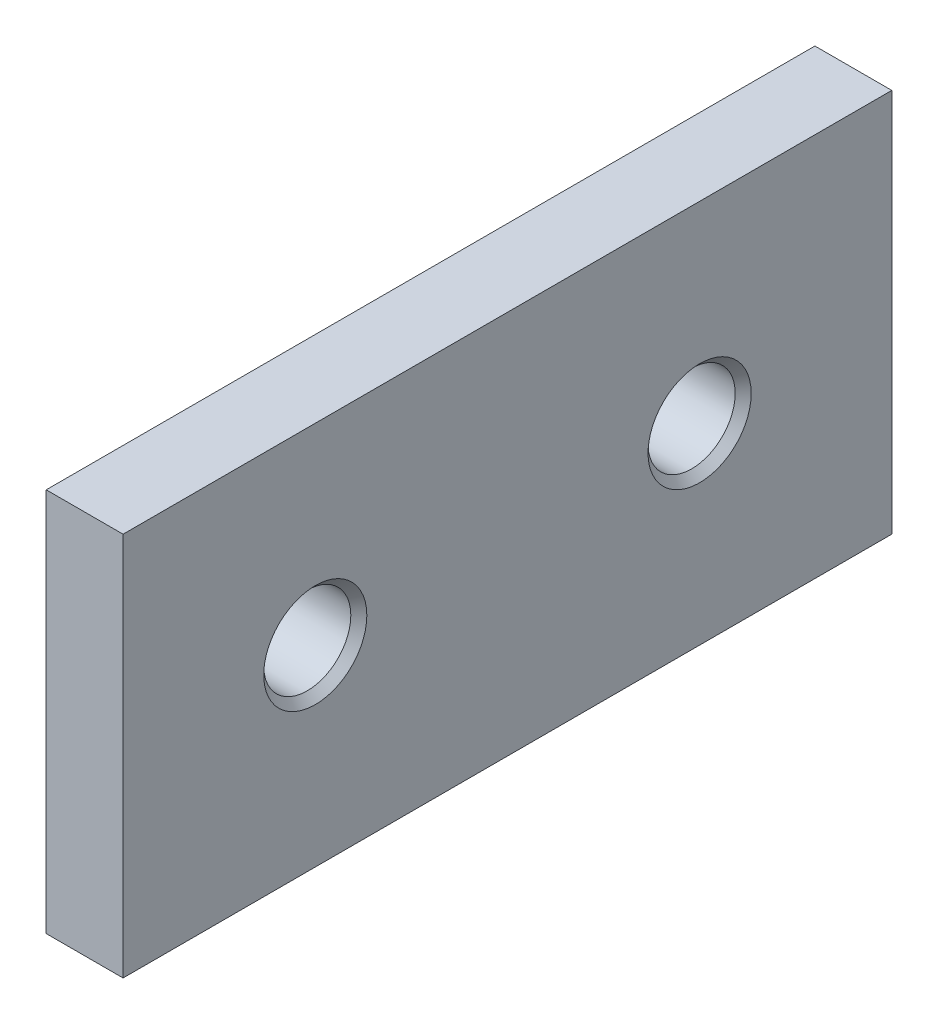
ISO-10303-21;
HEADER;
FILE_DESCRIPTION(('STEP AP214'),'2;1');
FILE_NAME('part.step','',(''),(''),'','','');
FILE_SCHEMA(('AUTOMOTIVE_DESIGN { 1 0 10303 214 1 1 1 1 }'));
ENDSEC;
DATA;
#1=APPLICATION_CONTEXT('core data for automotive mechanical design processes');
#2=APPLICATION_PROTOCOL_DEFINITION('international standard','automotive_design',2000,#1);
#3=PRODUCT_CONTEXT('',#1,'mechanical');
#4=PRODUCT('Part','Part','',(#3));
#5=PRODUCT_RELATED_PRODUCT_CATEGORY('part','',(#4));
#6=PRODUCT_DEFINITION_FORMATION('','',#4);
#7=PRODUCT_DEFINITION_CONTEXT('part definition',#1,'design');
#8=PRODUCT_DEFINITION('design','',#6,#7);
#9=PRODUCT_DEFINITION_SHAPE('','',#8);
#10=(LENGTH_UNIT() NAMED_UNIT(*) SI_UNIT(.MILLI.,.METRE.));
#11=(NAMED_UNIT(*) PLANE_ANGLE_UNIT() SI_UNIT($,.RADIAN.));
#12=(NAMED_UNIT(*) SI_UNIT($,.STERADIAN.) SOLID_ANGLE_UNIT());
#13=UNCERTAINTY_MEASURE_WITH_UNIT(LENGTH_MEASURE(1.E-05),#10,'distance_accuracy_value','');
#14=(GEOMETRIC_REPRESENTATION_CONTEXT(3) GLOBAL_UNCERTAINTY_ASSIGNED_CONTEXT((#13)) GLOBAL_UNIT_ASSIGNED_CONTEXT((#10,
#11,#12)) REPRESENTATION_CONTEXT('',''));
#15=CARTESIAN_POINT('',(0.,0.,0.));
#16=DIRECTION('',(0.,0.,1.));
#17=DIRECTION('',(1.,0.,0.));
#18=AXIS2_PLACEMENT_3D('',#15,#16,#17);
#19=CARTESIAN_POINT('',(53.,85.,30.));
#20=DIRECTION('',(0.,0.,1.));
#21=DIRECTION('',(0.,-1.,0.));
#22=AXIS2_PLACEMENT_3D('',#19,#20,#21);
#23=PLANE('',#22);
#24=DIRECTION('',(0.,-1.,0.));
#25=VECTOR('',#24,1.);
#26=CARTESIAN_POINT('',(59.,85.,30.));
#27=LINE('',#26,#25);
#28=CARTESIAN_POINT('',(59.,85.,30.));
#29=VERTEX_POINT('',#28);
#30=CARTESIAN_POINT('',(59.,55.,30.));
#31=VERTEX_POINT('',#30);
#32=EDGE_CURVE('E104',#29,#31,#27,.T.);
#33=ORIENTED_EDGE('',*,*,#32,.F.);
#34=DIRECTION('',(1.,0.,0.));
#35=VECTOR('',#34,1.);
#36=CARTESIAN_POINT('',(53.,85.,30.));
#37=LINE('',#36,#35);
#38=CARTESIAN_POINT('',(53.,85.,30.));
#39=VERTEX_POINT('',#38);
#40=EDGE_CURVE('E11',#39,#29,#37,.T.);
#41=ORIENTED_EDGE('',*,*,#40,.F.);
#42=DIRECTION('',(0.,-1.,0.));
#43=VECTOR('',#42,1.);
#44=CARTESIAN_POINT('',(53.,85.,30.));
#45=LINE('',#44,#43);
#46=CARTESIAN_POINT('',(53.,55.,30.));
#47=VERTEX_POINT('',#46);
#48=EDGE_CURVE('E97',#39,#47,#45,.T.);
#49=ORIENTED_EDGE('',*,*,#48,.T.);
#50=DIRECTION('',(1.,0.,0.));
#51=VECTOR('',#50,1.);
#52=CARTESIAN_POINT('',(53.,55.,30.));
#53=LINE('',#52,#51);
#54=EDGE_CURVE('E42',#47,#31,#53,.T.);
#55=ORIENTED_EDGE('',*,*,#54,.T.);
#56=EDGE_LOOP('',(#33,#41,#49,#55));
#57=FACE_BOUND('',#56,.T.);
#58=ADVANCED_FACE('F39',(#57),#23,.T.);
#59=CARTESIAN_POINT('',(53.,85.,30.));
#60=DIRECTION('',(0.,1.,0.));
#61=DIRECTION('',(0.,0.,1.));
#62=AXIS2_PLACEMENT_3D('',#59,#60,#61);
#63=PLANE('',#62);
#64=DIRECTION('',(0.,0.,1.));
#65=VECTOR('',#64,1.);
#66=CARTESIAN_POINT('',(59.,85.,30.));
#67=LINE('',#66,#65);
#68=CARTESIAN_POINT('',(59.,85.,-30.));
#69=VERTEX_POINT('',#68);
#70=EDGE_CURVE('E99',#69,#29,#67,.T.);
#71=ORIENTED_EDGE('',*,*,#70,.F.);
#72=DIRECTION('',(1.,0.,0.));
#73=VECTOR('',#72,1.);
#74=CARTESIAN_POINT('',(53.,85.,-30.));
#75=LINE('',#74,#73);
#76=CARTESIAN_POINT('',(53.,85.,-30.));
#77=VERTEX_POINT('',#76);
#78=EDGE_CURVE('E48',#77,#69,#75,.T.);
#79=ORIENTED_EDGE('',*,*,#78,.F.);
#80=DIRECTION('',(0.,0.,1.));
#81=VECTOR('',#80,1.);
#82=CARTESIAN_POINT('',(53.,85.,30.));
#83=LINE('',#82,#81);
#84=EDGE_CURVE('E94',#77,#39,#83,.T.);
#85=ORIENTED_EDGE('',*,*,#84,.T.);
#86=ORIENTED_EDGE('',*,*,#40,.T.);
#87=EDGE_LOOP('',(#71,#79,#85,#86));
#88=FACE_BOUND('',#87,.T.);
#89=ADVANCED_FACE('F115',(#88),#63,.T.);
#90=CARTESIAN_POINT('',(53.,85.,-30.));
#91=DIRECTION('',(0.,0.,-1.));
#92=DIRECTION('',(0.,1.,0.));
#93=AXIS2_PLACEMENT_3D('',#90,#91,#92);
#94=PLANE('',#93);
#95=DIRECTION('',(0.,1.,0.));
#96=VECTOR('',#95,1.);
#97=CARTESIAN_POINT('',(59.,85.,-30.));
#98=LINE('',#97,#96);
#99=CARTESIAN_POINT('',(59.,55.,-30.));
#100=VERTEX_POINT('',#99);
#101=EDGE_CURVE('E89',#100,#69,#98,.T.);
#102=ORIENTED_EDGE('',*,*,#101,.F.);
#103=DIRECTION('',(1.,0.,0.));
#104=VECTOR('',#103,1.);
#105=CARTESIAN_POINT('',(53.,55.,-30.));
#106=LINE('',#105,#104);
#107=CARTESIAN_POINT('',(53.,55.,-30.));
#108=VERTEX_POINT('',#107);
#109=EDGE_CURVE('E84',#108,#100,#106,.T.);
#110=ORIENTED_EDGE('',*,*,#109,.F.);
#111=DIRECTION('',(0.,1.,0.));
#112=VECTOR('',#111,1.);
#113=CARTESIAN_POINT('',(53.,85.,-30.));
#114=LINE('',#113,#112);
#115=EDGE_CURVE('E87',#108,#77,#114,.T.);
#116=ORIENTED_EDGE('',*,*,#115,.T.);
#117=ORIENTED_EDGE('',*,*,#78,.T.);
#118=EDGE_LOOP('',(#102,#110,#116,#117));
#119=FACE_BOUND('',#118,.T.);
#120=ADVANCED_FACE('F86',(#119),#94,.T.);
#121=CARTESIAN_POINT('',(53.,55.,30.));
#122=DIRECTION('',(0.,-1.,0.));
#123=DIRECTION('',(0.,0.,-1.));
#124=AXIS2_PLACEMENT_3D('',#121,#122,#123);
#125=PLANE('',#124);
#126=DIRECTION('',(0.,0.,-1.));
#127=VECTOR('',#126,1.);
#128=CARTESIAN_POINT('',(59.,55.,30.));
#129=LINE('',#128,#127);
#130=EDGE_CURVE('E107',#31,#100,#129,.T.);
#131=ORIENTED_EDGE('',*,*,#130,.F.);
#132=ORIENTED_EDGE('',*,*,#54,.F.);
#133=DIRECTION('',(0.,0.,-1.));
#134=VECTOR('',#133,1.);
#135=CARTESIAN_POINT('',(53.,55.,30.));
#136=LINE('',#135,#134);
#137=EDGE_CURVE('E93',#47,#108,#136,.T.);
#138=ORIENTED_EDGE('',*,*,#137,.T.);
#139=ORIENTED_EDGE('',*,*,#109,.T.);
#140=EDGE_LOOP('',(#131,#132,#138,#139));
#141=FACE_BOUND('',#140,.T.);
#142=ADVANCED_FACE('F96',(#141),#125,.T.);
#143=CARTESIAN_POINT('',(53.,0.,0.));
#144=DIRECTION('',(1.,0.,0.));
#145=DIRECTION('',(0.,0.,-1.));
#146=AXIS2_PLACEMENT_3D('',#143,#144,#145);
#147=PLANE('',#146);
#148=CARTESIAN_POINT('',(53.,70.,15.));
#149=DIRECTION('',(1.,0.,0.));
#150=DIRECTION('',(0.,0.,-1.));
#151=AXIS2_PLACEMENT_3D('',#148,#149,#150);
#152=CIRCLE('',#151,3.4);
#153=CARTESIAN_POINT('',(53.,70.,11.6));
#154=VERTEX_POINT('',#153);
#155=EDGE_CURVE('E162',#154,#154,#152,.T.);
#156=ORIENTED_EDGE('',*,*,#155,.T.);
#157=EDGE_LOOP('',(#156));
#158=FACE_BOUND('',#157,.T.);
#159=CARTESIAN_POINT('',(53.,70.,-15.));
#160=DIRECTION('',(1.,0.,0.));
#161=DIRECTION('',(0.,0.,-1.));
#162=AXIS2_PLACEMENT_3D('',#159,#160,#161);
#163=CIRCLE('',#162,3.4);
#164=CARTESIAN_POINT('',(53.,70.,-18.4));
#165=VERTEX_POINT('',#164);
#166=EDGE_CURVE('E108',#165,#165,#163,.T.);
#167=ORIENTED_EDGE('',*,*,#166,.T.);
#168=EDGE_LOOP('',(#167));
#169=FACE_BOUND('',#168,.T.);
#170=ORIENTED_EDGE('',*,*,#48,.F.);
#171=ORIENTED_EDGE('',*,*,#84,.F.);
#172=ORIENTED_EDGE('',*,*,#115,.F.);
#173=ORIENTED_EDGE('',*,*,#137,.F.);
#174=EDGE_LOOP('',(#170,#171,#172,#173));
#175=FACE_BOUND('',#174,.T.);
#176=ADVANCED_FACE('F92',(#158,#169,#175),#147,.F.);
#177=CARTESIAN_POINT('',(59.,0.,0.));
#178=DIRECTION('',(1.,0.,0.));
#179=DIRECTION('',(0.,0.,-1.));
#180=AXIS2_PLACEMENT_3D('',#177,#178,#179);
#181=PLANE('',#180);
#182=CARTESIAN_POINT('',(59.,70.,15.));
#183=DIRECTION('',(1.,0.,0.));
#184=DIRECTION('',(0.,0.,-1.));
#185=AXIS2_PLACEMENT_3D('',#182,#183,#184);
#186=CIRCLE('',#185,4.025);
#187=CARTESIAN_POINT('',(59.,70.,10.975));
#188=VERTEX_POINT('',#187);
#189=EDGE_CURVE('E160',#188,#188,#186,.T.);
#190=ORIENTED_EDGE('',*,*,#189,.F.);
#191=EDGE_LOOP('',(#190));
#192=FACE_BOUND('',#191,.T.);
#193=CARTESIAN_POINT('',(59.,70.,-15.));
#194=DIRECTION('',(1.,0.,0.));
#195=DIRECTION('',(0.,0.,-1.));
#196=AXIS2_PLACEMENT_3D('',#193,#194,#195);
#197=CIRCLE('',#196,4.025);
#198=CARTESIAN_POINT('',(59.,70.,-19.025));
#199=VERTEX_POINT('',#198);
#200=EDGE_CURVE('E166',#199,#199,#197,.T.);
#201=ORIENTED_EDGE('',*,*,#200,.F.);
#202=EDGE_LOOP('',(#201));
#203=FACE_BOUND('',#202,.T.);
#204=ORIENTED_EDGE('',*,*,#32,.T.);
#205=ORIENTED_EDGE('',*,*,#130,.T.);
#206=ORIENTED_EDGE('',*,*,#101,.T.);
#207=ORIENTED_EDGE('',*,*,#70,.T.);
#208=EDGE_LOOP('',(#204,#205,#206,#207));
#209=FACE_BOUND('',#208,.T.);
#210=ADVANCED_FACE('F114',(#192,#203,#209),#181,.T.);
#211=CARTESIAN_POINT('',(59.,70.,-15.));
#212=DIRECTION('',(1.,0.,0.));
#213=DIRECTION('',(0.,0.,-1.));
#214=AXIS2_PLACEMENT_3D('',#211,#212,#213);
#215=CYLINDRICAL_SURFACE('',#214,3.4);
#216=ORIENTED_EDGE('',*,*,#166,.F.);
#217=EDGE_LOOP('',(#216));
#218=FACE_BOUND('',#217,.T.);
#219=CARTESIAN_POINT('',(58.375,70.,-15.));
#220=DIRECTION('',(1.,0.,0.));
#221=DIRECTION('',(0.,0.,-1.));
#222=AXIS2_PLACEMENT_3D('',#219,#220,#221);
#223=CIRCLE('',#222,3.4);
#224=CARTESIAN_POINT('',(58.375,70.,-18.4));
#225=VERTEX_POINT('',#224);
#226=EDGE_CURVE('E169',#225,#225,#223,.T.);
#227=ORIENTED_EDGE('',*,*,#226,.T.);
#228=EDGE_LOOP('',(#227));
#229=FACE_BOUND('',#228,.T.);
#230=ADVANCED_FACE('F133',(#218,#229),#215,.F.);
#231=CARTESIAN_POINT('',(59.,70.,-15.));
#232=DIRECTION('',(1.,0.,0.));
#233=DIRECTION('',(0.,0.,-1.));
#234=AXIS2_PLACEMENT_3D('',#231,#232,#233);
#235=CONICAL_SURFACE('',#234,4.025,0.785398163397448);
#236=ORIENTED_EDGE('',*,*,#226,.F.);
#237=EDGE_LOOP('',(#236));
#238=FACE_BOUND('',#237,.T.);
#239=ORIENTED_EDGE('',*,*,#200,.T.);
#240=EDGE_LOOP('',(#239));
#241=FACE_BOUND('',#240,.T.);
#242=ADVANCED_FACE('F140',(#238,#241),#235,.F.);
#243=CARTESIAN_POINT('',(59.,70.,15.));
#244=DIRECTION('',(1.,0.,0.));
#245=DIRECTION('',(0.,0.,-1.));
#246=AXIS2_PLACEMENT_3D('',#243,#244,#245);
#247=CYLINDRICAL_SURFACE('',#246,3.4);
#248=ORIENTED_EDGE('',*,*,#155,.F.);
#249=EDGE_LOOP('',(#248));
#250=FACE_BOUND('',#249,.T.);
#251=CARTESIAN_POINT('',(58.375,70.,15.));
#252=DIRECTION('',(1.,0.,0.));
#253=DIRECTION('',(0.,0.,-1.));
#254=AXIS2_PLACEMENT_3D('',#251,#252,#253);
#255=CIRCLE('',#254,3.4);
#256=CARTESIAN_POINT('',(58.375,70.,11.6));
#257=VERTEX_POINT('',#256);
#258=EDGE_CURVE('E157',#257,#257,#255,.T.);
#259=ORIENTED_EDGE('',*,*,#258,.T.);
#260=EDGE_LOOP('',(#259));
#261=FACE_BOUND('',#260,.T.);
#262=ADVANCED_FACE('F144',(#250,#261),#247,.F.);
#263=CARTESIAN_POINT('',(59.,70.,15.));
#264=DIRECTION('',(1.,0.,0.));
#265=DIRECTION('',(0.,0.,-1.));
#266=AXIS2_PLACEMENT_3D('',#263,#264,#265);
#267=CONICAL_SURFACE('',#266,4.025,0.785398163397448);
#268=ORIENTED_EDGE('',*,*,#258,.F.);
#269=EDGE_LOOP('',(#268));
#270=FACE_BOUND('',#269,.T.);
#271=ORIENTED_EDGE('',*,*,#189,.T.);
#272=EDGE_LOOP('',(#271));
#273=FACE_BOUND('',#272,.T.);
#274=ADVANCED_FACE('F148',(#270,#273),#267,.F.);
#275=CLOSED_SHELL('',(#58,#89,#120,#142,#176,#210,#230,#242,#262,#274));
#276=MANIFOLD_SOLID_BREP('B2',#275);
#277=ADVANCED_BREP_SHAPE_REPRESENTATION('',(#18,#276),#14);
#278=SHAPE_DEFINITION_REPRESENTATION(#9,#277);
ENDSEC;
END-ISO-10303-21;
